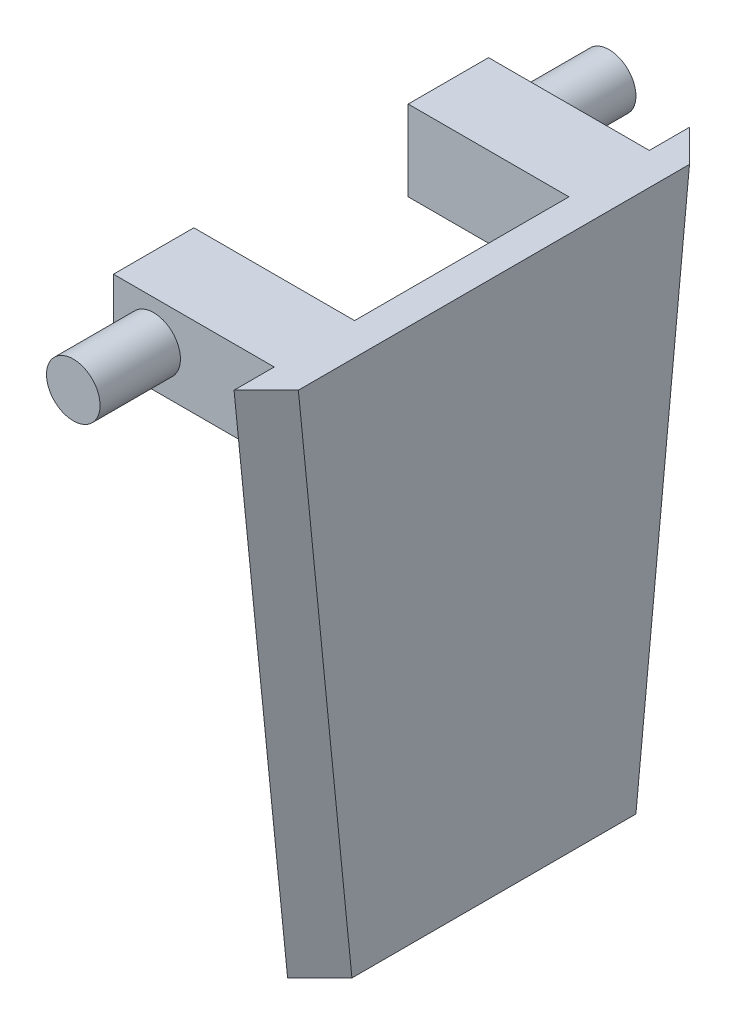
ISO-10303-21;
HEADER;
FILE_DESCRIPTION(('STEP AP214'),'2;1');
FILE_NAME('part.step','',(''),(''),'','','');
FILE_SCHEMA(('AUTOMOTIVE_DESIGN { 1 0 10303 214 1 1 1 1 }'));
ENDSEC;
DATA;
#1=APPLICATION_CONTEXT('core data for automotive mechanical design processes');
#2=APPLICATION_PROTOCOL_DEFINITION('international standard','automotive_design',2000,#1);
#3=PRODUCT_CONTEXT('',#1,'mechanical');
#4=PRODUCT('Part','Part','',(#3));
#5=PRODUCT_RELATED_PRODUCT_CATEGORY('part','',(#4));
#6=PRODUCT_DEFINITION_FORMATION('','',#4);
#7=PRODUCT_DEFINITION_CONTEXT('part definition',#1,'design');
#8=PRODUCT_DEFINITION('design','',#6,#7);
#9=PRODUCT_DEFINITION_SHAPE('','',#8);
#10=(LENGTH_UNIT() NAMED_UNIT(*) SI_UNIT(.MILLI.,.METRE.));
#11=(NAMED_UNIT(*) PLANE_ANGLE_UNIT() SI_UNIT($,.RADIAN.));
#12=(NAMED_UNIT(*) SI_UNIT($,.STERADIAN.) SOLID_ANGLE_UNIT());
#13=UNCERTAINTY_MEASURE_WITH_UNIT(LENGTH_MEASURE(1.E-05),#10,'distance_accuracy_value','');
#14=(GEOMETRIC_REPRESENTATION_CONTEXT(3) GLOBAL_UNCERTAINTY_ASSIGNED_CONTEXT((#13)) GLOBAL_UNIT_ASSIGNED_CONTEXT((#10,
#11,#12)) REPRESENTATION_CONTEXT('',''));
#15=CARTESIAN_POINT('',(0.,0.,0.));
#16=DIRECTION('',(0.,0.,1.));
#17=DIRECTION('',(1.,0.,0.));
#18=AXIS2_PLACEMENT_3D('',#15,#16,#17);
#19=CARTESIAN_POINT('',(6.,100.,42.5));
#20=DIRECTION('',(0.,-1.,0.));
#21=DIRECTION('',(0.,0.,-1.));
#22=AXIS2_PLACEMENT_3D('',#19,#20,#21);
#23=PLANE('',#22);
#24=DIRECTION('',(0.707106781186552,0.,0.707106781186543));
#25=VECTOR('',#24,1.);
#26=CARTESIAN_POINT('',(5.05000005064952,100.,-37.4499999493505));
#27=LINE('',#26,#25);
#28=CARTESIAN_POINT('',(0.,100.,-42.5));
#29=VERTEX_POINT('',#28);
#30=CARTESIAN_POINT('',(6.,100.,-36.5000000000001));
#31=VERTEX_POINT('',#30);
#32=EDGE_CURVE('E57',#29,#31,#27,.T.);
#33=ORIENTED_EDGE('',*,*,#32,.F.);
#34=DIRECTION('',(0.,0.,1.));
#35=VECTOR('',#34,1.);
#36=CARTESIAN_POINT('',(0.,100.,42.5));
#37=LINE('',#36,#35);
#38=CARTESIAN_POINT('',(0.,100.,-35.));
#39=VERTEX_POINT('',#38);
#40=EDGE_CURVE('E146',#29,#39,#37,.T.);
#41=ORIENTED_EDGE('',*,*,#40,.T.);
#42=DIRECTION('',(1.,0.,0.));
#43=VECTOR('',#42,1.);
#44=CARTESIAN_POINT('',(-30.,100.,-35.));
#45=LINE('',#44,#43);
#46=CARTESIAN_POINT('',(-30.,100.,-35.));
#47=VERTEX_POINT('',#46);
#48=EDGE_CURVE('E251',#47,#39,#45,.T.);
#49=ORIENTED_EDGE('',*,*,#48,.F.);
#50=DIRECTION('',(0.,0.,-1.));
#51=VECTOR('',#50,1.);
#52=CARTESIAN_POINT('',(-30.,100.,-35.));
#53=LINE('',#52,#51);
#54=CARTESIAN_POINT('',(-30.,100.,-20.));
#55=VERTEX_POINT('',#54);
#56=EDGE_CURVE('E249',#55,#47,#53,.T.);
#57=ORIENTED_EDGE('',*,*,#56,.F.);
#58=DIRECTION('',(1.,0.,0.));
#59=VECTOR('',#58,1.);
#60=CARTESIAN_POINT('',(-30.,100.,-20.));
#61=LINE('',#60,#59);
#62=CARTESIAN_POINT('',(0.,100.,-20.));
#63=VERTEX_POINT('',#62);
#64=EDGE_CURVE('E263',#55,#63,#61,.T.);
#65=ORIENTED_EDGE('',*,*,#64,.T.);
#66=CARTESIAN_POINT('',(0.,100.,20.));
#67=VERTEX_POINT('',#66);
#68=EDGE_CURVE('E159',#63,#67,#37,.T.);
#69=ORIENTED_EDGE('',*,*,#68,.T.);
#70=DIRECTION('',(1.,0.,0.));
#71=VECTOR('',#70,1.);
#72=CARTESIAN_POINT('',(-30.,100.,20.));
#73=LINE('',#72,#71);
#74=CARTESIAN_POINT('',(-30.,100.,20.));
#75=VERTEX_POINT('',#74);
#76=EDGE_CURVE('E206',#75,#67,#73,.T.);
#77=ORIENTED_EDGE('',*,*,#76,.F.);
#78=DIRECTION('',(0.,0.,-1.));
#79=VECTOR('',#78,1.);
#80=CARTESIAN_POINT('',(-30.,100.,35.));
#81=LINE('',#80,#79);
#82=CARTESIAN_POINT('',(-30.,100.,35.));
#83=VERTEX_POINT('',#82);
#84=EDGE_CURVE('E232',#83,#75,#81,.T.);
#85=ORIENTED_EDGE('',*,*,#84,.F.);
#86=DIRECTION('',(1.,0.,0.));
#87=VECTOR('',#86,1.);
#88=CARTESIAN_POINT('',(-30.,100.,35.));
#89=LINE('',#88,#87);
#90=CARTESIAN_POINT('',(0.,100.,35.));
#91=VERTEX_POINT('',#90);
#92=EDGE_CURVE('E175',#83,#91,#89,.T.);
#93=ORIENTED_EDGE('',*,*,#92,.T.);
#94=CARTESIAN_POINT('',(0.,100.,42.5));
#95=VERTEX_POINT('',#94);
#96=EDGE_CURVE('E139',#91,#95,#37,.T.);
#97=ORIENTED_EDGE('',*,*,#96,.T.);
#98=DIRECTION('',(0.707106781186551,0.,-0.707106781186544));
#99=VECTOR('',#98,1.);
#100=CARTESIAN_POINT('',(-0.0500000506495719,100.,42.5500000506496));
#101=LINE('',#100,#99);
#102=CARTESIAN_POINT('',(6.,100.,36.5000000000001));
#103=VERTEX_POINT('',#102);
#104=EDGE_CURVE('E173',#95,#103,#101,.T.);
#105=ORIENTED_EDGE('',*,*,#104,.T.);
#106=DIRECTION('',(0.,0.,1.));
#107=VECTOR('',#106,1.);
#108=CARTESIAN_POINT('',(6.,100.,42.5));
#109=LINE('',#108,#107);
#110=EDGE_CURVE('E149',#31,#103,#109,.T.);
#111=ORIENTED_EDGE('',*,*,#110,.F.);
#112=EDGE_LOOP('',(#33,#41,#49,#57,#65,#69,#77,#85,#93,#97,#105,#111));
#113=FACE_BOUND('',#112,.T.);
#114=ADVANCED_FACE('F42',(#113),#23,.F.);
#115=CARTESIAN_POINT('',(6.,0.,-32.5000000000001));
#116=DIRECTION('',(0.,1.,0.));
#117=DIRECTION('',(0.,0.,1.));
#118=AXIS2_PLACEMENT_3D('',#115,#116,#117);
#119=PLANE('',#118);
#120=DIRECTION('',(-0.707106781186552,0.,-0.707106781186543));
#121=VECTOR('',#120,1.);
#122=CARTESIAN_POINT('',(0.0500000506495723,0.,-32.4499999493505));
#123=LINE('',#122,#121);
#124=CARTESIAN_POINT('',(6.,0.,-26.5000000000002));
#125=VERTEX_POINT('',#124);
#126=CARTESIAN_POINT('',(0.,0.,-32.5000000000001));
#127=VERTEX_POINT('',#126);
#128=EDGE_CURVE('E133',#125,#127,#123,.T.);
#129=ORIENTED_EDGE('',*,*,#128,.F.);
#130=DIRECTION('',(0.,0.,-1.));
#131=VECTOR('',#130,1.);
#132=CARTESIAN_POINT('',(6.,0.,-32.5000000000001));
#133=LINE('',#132,#131);
#134=CARTESIAN_POINT('',(6.,0.,26.5));
#135=VERTEX_POINT('',#134);
#136=EDGE_CURVE('E50',#135,#125,#133,.T.);
#137=ORIENTED_EDGE('',*,*,#136,.F.);
#138=DIRECTION('',(-0.707106781186551,0.,0.707106781186544));
#139=VECTOR('',#138,1.);
#140=CARTESIAN_POINT('',(-5.05000005064962,0.,37.5500000506495));
#141=LINE('',#140,#139);
#142=CARTESIAN_POINT('',(0.,0.,32.4999999999999));
#143=VERTEX_POINT('',#142);
#144=EDGE_CURVE('E65',#135,#143,#141,.T.);
#145=ORIENTED_EDGE('',*,*,#144,.T.);
#146=DIRECTION('',(0.,0.,-1.));
#147=VECTOR('',#146,1.);
#148=CARTESIAN_POINT('',(0.,0.,-32.5000000000001));
#149=LINE('',#148,#147);
#150=EDGE_CURVE('E164',#143,#127,#149,.T.);
#151=ORIENTED_EDGE('',*,*,#150,.T.);
#152=EDGE_LOOP('',(#129,#137,#145,#151));
#153=FACE_BOUND('',#152,.T.);
#154=ADVANCED_FACE('F181',(#153),#119,.F.);
#155=CARTESIAN_POINT('',(0.,0.,0.));
#156=DIRECTION('',(-1.,0.,0.));
#157=DIRECTION('',(0.,0.,1.));
#158=AXIS2_PLACEMENT_3D('',#155,#156,#157);
#159=PLANE('',#158);
#160=ORIENTED_EDGE('',*,*,#96,.F.);
#161=DIRECTION('',(0.,1.,0.));
#162=VECTOR('',#161,1.);
#163=CARTESIAN_POINT('',(0.,100.,35.));
#164=LINE('',#163,#162);
#165=CARTESIAN_POINT('',(0.,85.,35.));
#166=VERTEX_POINT('',#165);
#167=EDGE_CURVE('E224',#166,#91,#164,.T.);
#168=ORIENTED_EDGE('',*,*,#167,.F.);
#169=DIRECTION('',(0.,0.,1.));
#170=VECTOR('',#169,1.);
#171=CARTESIAN_POINT('',(0.,85.,35.));
#172=LINE('',#171,#170);
#173=CARTESIAN_POINT('',(0.,85.,20.));
#174=VERTEX_POINT('',#173);
#175=EDGE_CURVE('E216',#174,#166,#172,.T.);
#176=ORIENTED_EDGE('',*,*,#175,.F.);
#177=DIRECTION('',(0.,-1.,0.));
#178=VECTOR('',#177,1.);
#179=CARTESIAN_POINT('',(0.,100.,20.));
#180=LINE('',#179,#178);
#181=EDGE_CURVE('E219',#67,#174,#180,.T.);
#182=ORIENTED_EDGE('',*,*,#181,.F.);
#183=ORIENTED_EDGE('',*,*,#68,.F.);
#184=DIRECTION('',(0.,1.,0.));
#185=VECTOR('',#184,1.);
#186=CARTESIAN_POINT('',(0.,100.,-20.));
#187=LINE('',#186,#185);
#188=CARTESIAN_POINT('',(0.,85.,-20.));
#189=VERTEX_POINT('',#188);
#190=EDGE_CURVE('E243',#189,#63,#187,.T.);
#191=ORIENTED_EDGE('',*,*,#190,.F.);
#192=DIRECTION('',(0.,0.,1.));
#193=VECTOR('',#192,1.);
#194=CARTESIAN_POINT('',(0.,85.,-35.));
#195=LINE('',#194,#193);
#196=CARTESIAN_POINT('',(0.,85.,-35.));
#197=VERTEX_POINT('',#196);
#198=EDGE_CURVE('E254',#197,#189,#195,.T.);
#199=ORIENTED_EDGE('',*,*,#198,.F.);
#200=DIRECTION('',(0.,-1.,0.));
#201=VECTOR('',#200,1.);
#202=CARTESIAN_POINT('',(0.,100.,-35.));
#203=LINE('',#202,#201);
#204=EDGE_CURVE('E156',#39,#197,#203,.T.);
#205=ORIENTED_EDGE('',*,*,#204,.F.);
#206=ORIENTED_EDGE('',*,*,#40,.F.);
#207=DIRECTION('',(0.,0.995037190209989,-0.0995037190209979));
#208=VECTOR('',#207,1.);
#209=CARTESIAN_POINT('',(0.,100.,-42.5));
#210=LINE('',#209,#208);
#211=EDGE_CURVE('E130',#127,#29,#210,.T.);
#212=ORIENTED_EDGE('',*,*,#211,.F.);
#213=ORIENTED_EDGE('',*,*,#150,.F.);
#214=DIRECTION('',(0.,-0.995037190209989,-0.099503719021));
#215=VECTOR('',#214,1.);
#216=CARTESIAN_POINT('',(0.,0.,32.4999999999999));
#217=LINE('',#216,#215);
#218=EDGE_CURVE('E158',#95,#143,#217,.T.);
#219=ORIENTED_EDGE('',*,*,#218,.F.);
#220=EDGE_LOOP('',(#160,#168,#176,#182,#183,#191,#199,#205,#206,#212,#213,#219));
#221=FACE_BOUND('',#220,.T.);
#222=ADVANCED_FACE('F154',(#221),#159,.T.);
#223=CARTESIAN_POINT('',(6.,0.,0.));
#224=DIRECTION('',(-1.,0.,0.));
#225=DIRECTION('',(0.,0.,1.));
#226=AXIS2_PLACEMENT_3D('',#223,#224,#225);
#227=PLANE('',#226);
#228=ORIENTED_EDGE('',*,*,#136,.T.);
#229=DIRECTION('',(0.,0.995037190209989,-0.0995037190209979));
#230=VECTOR('',#229,1.);
#231=CARTESIAN_POINT('',(6.,-1.00000101299146,-26.399999898701));
#232=LINE('',#231,#230);
#233=EDGE_CURVE('E151',#125,#31,#232,.T.);
#234=ORIENTED_EDGE('',*,*,#233,.T.);
#235=ORIENTED_EDGE('',*,*,#110,.T.);
#236=DIRECTION('',(0.,-0.995037190209989,-0.0995037190209999));
#237=VECTOR('',#236,1.);
#238=CARTESIAN_POINT('',(6.,101.000001012991,36.6000001012992));
#239=LINE('',#238,#237);
#240=EDGE_CURVE('E193',#103,#135,#239,.T.);
#241=ORIENTED_EDGE('',*,*,#240,.T.);
#242=EDGE_LOOP('',(#228,#234,#235,#241));
#243=FACE_BOUND('',#242,.T.);
#244=ADVANCED_FACE('F276',(#243),#227,.F.);
#245=CARTESIAN_POINT('',(-30.,100.,-35.));
#246=DIRECTION('',(0.,0.,1.));
#247=DIRECTION('',(0.,-1.,0.));
#248=AXIS2_PLACEMENT_3D('',#245,#246,#247);
#249=PLANE('',#248);
#250=CARTESIAN_POINT('',(-22.5,92.5382588039935,-35.));
#251=DIRECTION('',(0.,0.,1.));
#252=DIRECTION('',(0.,-1.,0.));
#253=AXIS2_PLACEMENT_3D('',#250,#251,#252);
#254=CIRCLE('',#253,5.);
#255=CARTESIAN_POINT('',(-22.5,87.5382588039935,-35.));
#256=VERTEX_POINT('',#255);
#257=EDGE_CURVE('E11',#256,#256,#254,.F.);
#258=ORIENTED_EDGE('',*,*,#257,.F.);
#259=EDGE_LOOP('',(#258));
#260=FACE_BOUND('',#259,.T.);
#261=ORIENTED_EDGE('',*,*,#204,.T.);
#262=DIRECTION('',(1.,0.,0.));
#263=VECTOR('',#262,1.);
#264=CARTESIAN_POINT('',(-30.,85.,-35.));
#265=LINE('',#264,#263);
#266=CARTESIAN_POINT('',(-30.,85.,-35.));
#267=VERTEX_POINT('',#266);
#268=EDGE_CURVE('E140',#267,#197,#265,.T.);
#269=ORIENTED_EDGE('',*,*,#268,.F.);
#270=DIRECTION('',(0.,-1.,0.));
#271=VECTOR('',#270,1.);
#272=CARTESIAN_POINT('',(-30.,100.,-35.));
#273=LINE('',#272,#271);
#274=EDGE_CURVE('E238',#47,#267,#273,.T.);
#275=ORIENTED_EDGE('',*,*,#274,.F.);
#276=ORIENTED_EDGE('',*,*,#48,.T.);
#277=EDGE_LOOP('',(#261,#269,#275,#276));
#278=FACE_BOUND('',#277,.T.);
#279=ADVANCED_FACE('F281',(#260,#278),#249,.F.);
#280=CARTESIAN_POINT('',(-30.,85.,-35.));
#281=DIRECTION('',(0.,1.,0.));
#282=DIRECTION('',(0.,0.,1.));
#283=AXIS2_PLACEMENT_3D('',#280,#281,#282);
#284=PLANE('',#283);
#285=ORIENTED_EDGE('',*,*,#198,.T.);
#286=DIRECTION('',(1.,0.,0.));
#287=VECTOR('',#286,1.);
#288=CARTESIAN_POINT('',(-30.,85.,-20.));
#289=LINE('',#288,#287);
#290=CARTESIAN_POINT('',(-30.,85.,-20.));
#291=VERTEX_POINT('',#290);
#292=EDGE_CURVE('E266',#291,#189,#289,.T.);
#293=ORIENTED_EDGE('',*,*,#292,.F.);
#294=DIRECTION('',(0.,0.,1.));
#295=VECTOR('',#294,1.);
#296=CARTESIAN_POINT('',(-30.,85.,-35.));
#297=LINE('',#296,#295);
#298=EDGE_CURVE('E242',#267,#291,#297,.T.);
#299=ORIENTED_EDGE('',*,*,#298,.F.);
#300=ORIENTED_EDGE('',*,*,#268,.T.);
#301=EDGE_LOOP('',(#285,#293,#299,#300));
#302=FACE_BOUND('',#301,.T.);
#303=ADVANCED_FACE('F287',(#302),#284,.F.);
#304=CARTESIAN_POINT('',(-30.,100.,-20.));
#305=DIRECTION('',(0.,0.,-1.));
#306=DIRECTION('',(0.,1.,0.));
#307=AXIS2_PLACEMENT_3D('',#304,#305,#306);
#308=PLANE('',#307);
#309=ORIENTED_EDGE('',*,*,#190,.T.);
#310=ORIENTED_EDGE('',*,*,#64,.F.);
#311=DIRECTION('',(0.,1.,0.));
#312=VECTOR('',#311,1.);
#313=CARTESIAN_POINT('',(-30.,100.,-20.));
#314=LINE('',#313,#312);
#315=EDGE_CURVE('E246',#291,#55,#314,.T.);
#316=ORIENTED_EDGE('',*,*,#315,.F.);
#317=ORIENTED_EDGE('',*,*,#292,.T.);
#318=EDGE_LOOP('',(#309,#310,#316,#317));
#319=FACE_BOUND('',#318,.T.);
#320=ADVANCED_FACE('F318',(#319),#308,.F.);
#321=CARTESIAN_POINT('',(-30.,0.,0.));
#322=DIRECTION('',(-1.,0.,0.));
#323=DIRECTION('',(0.,0.,1.));
#324=AXIS2_PLACEMENT_3D('',#321,#322,#323);
#325=PLANE('',#324);
#326=ORIENTED_EDGE('',*,*,#274,.T.);
#327=ORIENTED_EDGE('',*,*,#298,.T.);
#328=ORIENTED_EDGE('',*,*,#315,.T.);
#329=ORIENTED_EDGE('',*,*,#56,.T.);
#330=EDGE_LOOP('',(#326,#327,#328,#329));
#331=FACE_BOUND('',#330,.T.);
#332=ADVANCED_FACE('F327',(#331),#325,.T.);
#333=CARTESIAN_POINT('',(-30.,100.,35.));
#334=DIRECTION('',(0.,0.,-1.));
#335=DIRECTION('',(0.,1.,0.));
#336=AXIS2_PLACEMENT_3D('',#333,#334,#335);
#337=PLANE('',#336);
#338=CARTESIAN_POINT('',(-22.5,92.5382588039935,35.));
#339=DIRECTION('',(0.,0.,-1.));
#340=DIRECTION('',(0.,1.,0.));
#341=AXIS2_PLACEMENT_3D('',#338,#339,#340);
#342=CIRCLE('',#341,5.);
#343=CARTESIAN_POINT('',(-22.5,97.5382588039935,35.));
#344=VERTEX_POINT('',#343);
#345=EDGE_CURVE('E184',#344,#344,#342,.T.);
#346=ORIENTED_EDGE('',*,*,#345,.T.);
#347=EDGE_LOOP('',(#346));
#348=FACE_BOUND('',#347,.T.);
#349=ORIENTED_EDGE('',*,*,#167,.T.);
#350=ORIENTED_EDGE('',*,*,#92,.F.);
#351=DIRECTION('',(0.,1.,0.));
#352=VECTOR('',#351,1.);
#353=CARTESIAN_POINT('',(-30.,100.,35.));
#354=LINE('',#353,#352);
#355=CARTESIAN_POINT('',(-30.,85.,35.));
#356=VERTEX_POINT('',#355);
#357=EDGE_CURVE('E220',#356,#83,#354,.T.);
#358=ORIENTED_EDGE('',*,*,#357,.F.);
#359=DIRECTION('',(1.,0.,0.));
#360=VECTOR('',#359,1.);
#361=CARTESIAN_POINT('',(-30.,85.,35.));
#362=LINE('',#361,#360);
#363=EDGE_CURVE('E211',#356,#166,#362,.T.);
#364=ORIENTED_EDGE('',*,*,#363,.T.);
#365=EDGE_LOOP('',(#349,#350,#358,#364));
#366=FACE_BOUND('',#365,.T.);
#367=ADVANCED_FACE('F336',(#348,#366),#337,.F.);
#368=CARTESIAN_POINT('',(-30.,100.,20.));
#369=DIRECTION('',(0.,0.,1.));
#370=DIRECTION('',(0.,-1.,0.));
#371=AXIS2_PLACEMENT_3D('',#368,#369,#370);
#372=PLANE('',#371);
#373=ORIENTED_EDGE('',*,*,#181,.T.);
#374=DIRECTION('',(1.,0.,0.));
#375=VECTOR('',#374,1.);
#376=CARTESIAN_POINT('',(-30.,85.,20.));
#377=LINE('',#376,#375);
#378=CARTESIAN_POINT('',(-30.,85.,20.));
#379=VERTEX_POINT('',#378);
#380=EDGE_CURVE('E208',#379,#174,#377,.T.);
#381=ORIENTED_EDGE('',*,*,#380,.F.);
#382=DIRECTION('',(0.,-1.,0.));
#383=VECTOR('',#382,1.);
#384=CARTESIAN_POINT('',(-30.,100.,20.));
#385=LINE('',#384,#383);
#386=EDGE_CURVE('E229',#75,#379,#385,.T.);
#387=ORIENTED_EDGE('',*,*,#386,.F.);
#388=ORIENTED_EDGE('',*,*,#76,.T.);
#389=EDGE_LOOP('',(#373,#381,#387,#388));
#390=FACE_BOUND('',#389,.T.);
#391=ADVANCED_FACE('F346',(#390),#372,.F.);
#392=CARTESIAN_POINT('',(-30.,85.,35.));
#393=DIRECTION('',(0.,1.,0.));
#394=DIRECTION('',(0.,0.,1.));
#395=AXIS2_PLACEMENT_3D('',#392,#393,#394);
#396=PLANE('',#395);
#397=ORIENTED_EDGE('',*,*,#175,.T.);
#398=ORIENTED_EDGE('',*,*,#363,.F.);
#399=DIRECTION('',(0.,0.,1.));
#400=VECTOR('',#399,1.);
#401=CARTESIAN_POINT('',(-30.,85.,35.));
#402=LINE('',#401,#400);
#403=EDGE_CURVE('E215',#379,#356,#402,.T.);
#404=ORIENTED_EDGE('',*,*,#403,.F.);
#405=ORIENTED_EDGE('',*,*,#380,.T.);
#406=EDGE_LOOP('',(#397,#398,#404,#405));
#407=FACE_BOUND('',#406,.T.);
#408=ADVANCED_FACE('F356',(#407),#396,.F.);
#409=CARTESIAN_POINT('',(-30.,0.,0.));
#410=DIRECTION('',(1.,0.,0.));
#411=DIRECTION('',(0.,0.,-1.));
#412=AXIS2_PLACEMENT_3D('',#409,#410,#411);
#413=PLANE('',#412);
#414=ORIENTED_EDGE('',*,*,#357,.T.);
#415=ORIENTED_EDGE('',*,*,#84,.T.);
#416=ORIENTED_EDGE('',*,*,#386,.T.);
#417=ORIENTED_EDGE('',*,*,#403,.T.);
#418=EDGE_LOOP('',(#414,#415,#416,#417));
#419=FACE_BOUND('',#418,.T.);
#420=ADVANCED_FACE('F365',(#419),#413,.F.);
#421=CARTESIAN_POINT('',(-22.5,92.5382588039935,-50.));
#422=DIRECTION('',(0.,0.,1.));
#423=DIRECTION('',(0.,-1.,0.));
#424=AXIS2_PLACEMENT_3D('',#421,#422,#423);
#425=CYLINDRICAL_SURFACE('',#424,5.);
#426=CARTESIAN_POINT('',(-22.5,92.5382588039935,-50.));
#427=DIRECTION('',(0.,0.,-1.));
#428=DIRECTION('',(0.,1.,0.));
#429=AXIS2_PLACEMENT_3D('',#426,#427,#428);
#430=CIRCLE('',#429,5.);
#431=CARTESIAN_POINT('',(-22.5,97.5382588039935,-50.));
#432=VERTEX_POINT('',#431);
#433=EDGE_CURVE('E199',#432,#432,#430,.T.);
#434=ORIENTED_EDGE('',*,*,#433,.F.);
#435=EDGE_LOOP('',(#434));
#436=FACE_BOUND('',#435,.T.);
#437=ORIENTED_EDGE('',*,*,#257,.T.);
#438=EDGE_LOOP('',(#437));
#439=FACE_BOUND('',#438,.T.);
#440=ADVANCED_FACE('F373',(#436,#439),#425,.T.);
#441=CARTESIAN_POINT('',(-22.5,92.5382588039935,-50.));
#442=DIRECTION('',(0.,0.,-1.));
#443=DIRECTION('',(0.,1.,0.));
#444=AXIS2_PLACEMENT_3D('',#441,#442,#443);
#445=PLANE('',#444);
#446=ORIENTED_EDGE('',*,*,#433,.T.);
#447=EDGE_LOOP('',(#446));
#448=FACE_BOUND('',#447,.T.);
#449=ADVANCED_FACE('F381',(#448),#445,.T.);
#450=CARTESIAN_POINT('',(-22.5,92.5382588039935,50.));
#451=DIRECTION('',(0.,0.,-1.));
#452=DIRECTION('',(0.,1.,0.));
#453=AXIS2_PLACEMENT_3D('',#450,#451,#452);
#454=CYLINDRICAL_SURFACE('',#453,5.);
#455=CARTESIAN_POINT('',(-22.5,92.5382588039935,50.));
#456=DIRECTION('',(0.,0.,-1.));
#457=DIRECTION('',(0.,1.,0.));
#458=AXIS2_PLACEMENT_3D('',#455,#456,#457);
#459=CIRCLE('',#458,5.);
#460=CARTESIAN_POINT('',(-22.5,97.5382588039935,50.));
#461=VERTEX_POINT('',#460);
#462=EDGE_CURVE('E190',#461,#461,#459,.T.);
#463=ORIENTED_EDGE('',*,*,#462,.T.);
#464=EDGE_LOOP('',(#463));
#465=FACE_BOUND('',#464,.T.);
#466=ORIENTED_EDGE('',*,*,#345,.F.);
#467=EDGE_LOOP('',(#466));
#468=FACE_BOUND('',#467,.T.);
#469=ADVANCED_FACE('F389',(#465,#468),#454,.T.);
#470=CARTESIAN_POINT('',(-22.5,92.5382588039935,50.));
#471=DIRECTION('',(0.,0.,1.));
#472=DIRECTION('',(0.,1.,0.));
#473=AXIS2_PLACEMENT_3D('',#470,#471,#472);
#474=PLANE('',#473);
#475=ORIENTED_EDGE('',*,*,#462,.F.);
#476=EDGE_LOOP('',(#475));
#477=FACE_BOUND('',#476,.T.);
#478=ADVANCED_FACE('F397',(#477),#474,.T.);
#479=CARTESIAN_POINT('',(0.,101.000001012991,42.6000001012991));
#480=DIRECTION('',(0.705345615858594,-0.0705345615858609,0.705345615858602));
#481=DIRECTION('',(0.707106781186551,0.,-0.707106781186544));
#482=AXIS2_PLACEMENT_3D('',#479,#480,#481);
#483=PLANE('',#482);
#484=ORIENTED_EDGE('',*,*,#240,.F.);
#485=ORIENTED_EDGE('',*,*,#104,.F.);
#486=ORIENTED_EDGE('',*,*,#218,.T.);
#487=ORIENTED_EDGE('',*,*,#144,.F.);
#488=EDGE_LOOP('',(#484,#485,#486,#487));
#489=FACE_BOUND('',#488,.T.);
#490=ADVANCED_FACE('F178',(#489),#483,.T.);
#491=CARTESIAN_POINT('',(0.,-1.00000101299146,-32.399999898701));
#492=DIRECTION('',(-0.705345615858594,0.0705345615858596,0.705345615858603));
#493=DIRECTION('',(0.707106781186552,0.,0.707106781186543));
#494=AXIS2_PLACEMENT_3D('',#491,#492,#493);
#495=PLANE('',#494);
#496=ORIENTED_EDGE('',*,*,#128,.T.);
#497=ORIENTED_EDGE('',*,*,#211,.T.);
#498=ORIENTED_EDGE('',*,*,#32,.T.);
#499=ORIENTED_EDGE('',*,*,#233,.F.);
#500=EDGE_LOOP('',(#496,#497,#498,#499));
#501=FACE_BOUND('',#500,.T.);
#502=ADVANCED_FACE('F131',(#501),#495,.F.);
#503=CLOSED_SHELL('',(#114,#154,#222,#244,#279,#303,#320,#332,#367,#391,#408,#420,#440,#449,
#469,#478,#490,#502));
#504=MANIFOLD_SOLID_BREP('B2',#503);
#505=ADVANCED_BREP_SHAPE_REPRESENTATION('',(#18,#504),#14);
#506=SHAPE_DEFINITION_REPRESENTATION(#9,#505);
ENDSEC;
END-ISO-10303-21;
